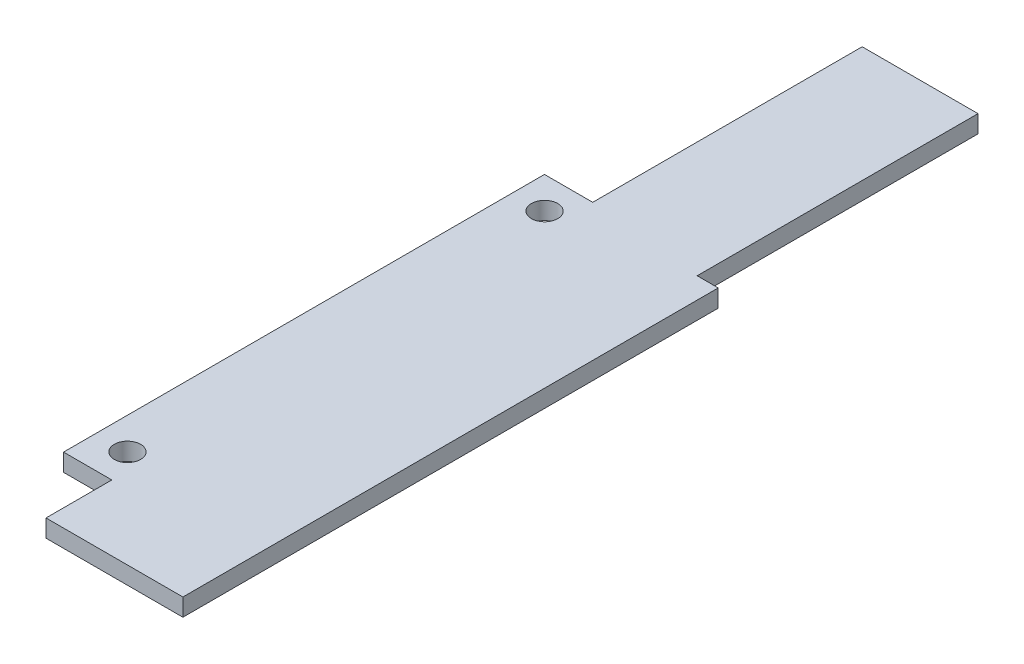
ISO-10303-21;
HEADER;
FILE_DESCRIPTION(('STEP AP214'),'2;1');
FILE_NAME('part.step','',(''),(''),'','','');
FILE_SCHEMA(('AUTOMOTIVE_DESIGN { 1 0 10303 214 1 1 1 1 }'));
ENDSEC;
DATA;
#1=APPLICATION_CONTEXT('core data for automotive mechanical design processes');
#2=APPLICATION_PROTOCOL_DEFINITION('international standard','automotive_design',2000,#1);
#3=PRODUCT_CONTEXT('',#1,'mechanical');
#4=PRODUCT('Part','Part','',(#3));
#5=PRODUCT_RELATED_PRODUCT_CATEGORY('part','',(#4));
#6=PRODUCT_DEFINITION_FORMATION('','',#4);
#7=PRODUCT_DEFINITION_CONTEXT('part definition',#1,'design');
#8=PRODUCT_DEFINITION('design','',#6,#7);
#9=PRODUCT_DEFINITION_SHAPE('','',#8);
#10=(LENGTH_UNIT() NAMED_UNIT(*) SI_UNIT(.MILLI.,.METRE.));
#11=(NAMED_UNIT(*) PLANE_ANGLE_UNIT() SI_UNIT($,.RADIAN.));
#12=(NAMED_UNIT(*) SI_UNIT($,.STERADIAN.) SOLID_ANGLE_UNIT());
#13=UNCERTAINTY_MEASURE_WITH_UNIT(LENGTH_MEASURE(1.E-05),#10,'distance_accuracy_value','');
#14=(GEOMETRIC_REPRESENTATION_CONTEXT(3) GLOBAL_UNCERTAINTY_ASSIGNED_CONTEXT((#13)) GLOBAL_UNIT_ASSIGNED_CONTEXT((#10,
#11,#12)) REPRESENTATION_CONTEXT('',''));
#15=CARTESIAN_POINT('',(0.,0.,0.));
#16=DIRECTION('',(0.,0.,1.));
#17=DIRECTION('',(1.,0.,0.));
#18=AXIS2_PLACEMENT_3D('',#15,#16,#17);
#19=CARTESIAN_POINT('',(44.8,21.5,-42.5));
#20=DIRECTION('',(0.,-1.,0.));
#21=DIRECTION('',(0.,0.,-1.));
#22=AXIS2_PLACEMENT_3D('',#19,#20,#21);
#23=PLANE('',#22);
#24=DIRECTION('',(1.,0.,0.));
#25=VECTOR('',#24,1.);
#26=CARTESIAN_POINT('',(-65.5,21.5,18.));
#27=LINE('',#26,#25);
#28=CARTESIAN_POINT('',(-65.5,21.5,18.));
#29=VERTEX_POINT('',#28);
#30=CARTESIAN_POINT('',(-60.,21.5,18.));
#31=VERTEX_POINT('',#30);
#32=EDGE_CURVE('E196',#29,#31,#27,.T.);
#33=ORIENTED_EDGE('',*,*,#32,.F.);
#34=DIRECTION('',(0.,0.,1.));
#35=VECTOR('',#34,1.);
#36=CARTESIAN_POINT('',(-65.5,21.5,-36.8));
#37=LINE('',#36,#35);
#38=CARTESIAN_POINT('',(-65.5,21.5,-36.8));
#39=VERTEX_POINT('',#38);
#40=EDGE_CURVE('E156',#39,#29,#37,.T.);
#41=ORIENTED_EDGE('',*,*,#40,.F.);
#42=DIRECTION('',(-1.,0.,0.));
#43=VECTOR('',#42,1.);
#44=CARTESIAN_POINT('',(-60.,21.5,-36.8));
#45=LINE('',#44,#43);
#46=CARTESIAN_POINT('',(-60.,21.5,-36.8));
#47=VERTEX_POINT('',#46);
#48=EDGE_CURVE('E201',#47,#39,#45,.T.);
#49=ORIENTED_EDGE('',*,*,#48,.F.);
#50=DIRECTION('',(0.,0.,1.));
#51=VECTOR('',#50,1.);
#52=CARTESIAN_POINT('',(-60.,21.5,-67.5));
#53=LINE('',#52,#51);
#54=CARTESIAN_POINT('',(-60.,21.5,-67.5));
#55=VERTEX_POINT('',#54);
#56=EDGE_CURVE('E143',#55,#47,#53,.T.);
#57=ORIENTED_EDGE('',*,*,#56,.F.);
#58=DIRECTION('',(-1.,0.,0.));
#59=VECTOR('',#58,1.);
#60=CARTESIAN_POINT('',(-55.3,21.5,-67.5));
#61=LINE('',#60,#59);
#62=CARTESIAN_POINT('',(-46.8,21.5,-67.5));
#63=VERTEX_POINT('',#62);
#64=EDGE_CURVE('E139',#63,#55,#61,.T.);
#65=ORIENTED_EDGE('',*,*,#64,.F.);
#66=DIRECTION('',(0.,0.,1.));
#67=VECTOR('',#66,1.);
#68=CARTESIAN_POINT('',(-46.8,21.5,-62.8));
#69=LINE('',#68,#67);
#70=CARTESIAN_POINT('',(-46.8,21.5,-35.5));
#71=VERTEX_POINT('',#70);
#72=EDGE_CURVE('E72',#63,#71,#69,.T.);
#73=ORIENTED_EDGE('',*,*,#72,.T.);
#74=DIRECTION('',(-1.,0.,0.));
#75=VECTOR('',#74,1.);
#76=CARTESIAN_POINT('',(-44.4,21.5,-35.5));
#77=LINE('',#76,#75);
#78=CARTESIAN_POINT('',(-44.4,21.5,-35.5));
#79=VERTEX_POINT('',#78);
#80=EDGE_CURVE('E188',#79,#71,#77,.T.);
#81=ORIENTED_EDGE('',*,*,#80,.F.);
#82=DIRECTION('',(0.,0.,-1.));
#83=VECTOR('',#82,1.);
#84=CARTESIAN_POINT('',(-44.4,21.5,-29.3));
#85=LINE('',#84,#83);
#86=CARTESIAN_POINT('',(-44.4,21.5,25.5));
#87=VERTEX_POINT('',#86);
#88=EDGE_CURVE('E120',#87,#79,#85,.T.);
#89=ORIENTED_EDGE('',*,*,#88,.F.);
#90=DIRECTION('',(1.,0.,0.));
#91=VECTOR('',#90,1.);
#92=CARTESIAN_POINT('',(-16.9,21.5,25.5));
#93=LINE('',#92,#91);
#94=CARTESIAN_POINT('',(-60.,21.5,25.5));
#95=VERTEX_POINT('',#94);
#96=EDGE_CURVE('E185',#95,#87,#93,.T.);
#97=ORIENTED_EDGE('',*,*,#96,.F.);
#98=DIRECTION('',(0.,0.,1.));
#99=VECTOR('',#98,1.);
#100=CARTESIAN_POINT('',(-60.,21.5,18.));
#101=LINE('',#100,#99);
#102=EDGE_CURVE('E148',#31,#95,#101,.T.);
#103=ORIENTED_EDGE('',*,*,#102,.F.);
#104=EDGE_LOOP('',(#33,#41,#49,#57,#65,#73,#81,#89,#97,#103));
#105=FACE_BOUND('',#104,.T.);
#106=CARTESIAN_POINT('',(-61.8792707762021,21.5,-33.1911439682998));
#107=DIRECTION('',(0.,1.,0.));
#108=DIRECTION('',(0.,0.,1.));
#109=AXIS2_PLACEMENT_3D('',#106,#107,#108);
#110=CIRCLE('',#109,1.5);
#111=CARTESIAN_POINT('',(-61.8792707762021,21.5,-31.6911439682998));
#112=VERTEX_POINT('',#111);
#113=EDGE_CURVE('E63',#112,#112,#110,.T.);
#114=ORIENTED_EDGE('',*,*,#113,.T.);
#115=EDGE_LOOP('',(#114));
#116=FACE_BOUND('',#115,.T.);
#117=CARTESIAN_POINT('',(-61.8792707762021,21.5,14.3376182989599));
#118=DIRECTION('',(0.,1.,0.));
#119=DIRECTION('',(0.,0.,1.));
#120=AXIS2_PLACEMENT_3D('',#117,#118,#119);
#121=CIRCLE('',#120,1.5);
#122=CARTESIAN_POINT('',(-61.8792707762021,21.5,15.8376182989599));
#123=VERTEX_POINT('',#122);
#124=EDGE_CURVE('E11',#123,#123,#121,.T.);
#125=ORIENTED_EDGE('',*,*,#124,.T.);
#126=EDGE_LOOP('',(#125));
#127=FACE_BOUND('',#126,.T.);
#128=ADVANCED_FACE('F53',(#105,#116,#127),#23,.T.);
#129=CARTESIAN_POINT('',(-60.,23.5,-67.5));
#130=DIRECTION('',(1.,0.,0.));
#131=DIRECTION('',(0.,0.,-1.));
#132=AXIS2_PLACEMENT_3D('',#129,#130,#131);
#133=PLANE('',#132);
#134=ORIENTED_EDGE('',*,*,#56,.T.);
#135=DIRECTION('',(0.,-1.,0.));
#136=VECTOR('',#135,1.);
#137=CARTESIAN_POINT('',(-60.,23.5,-36.8));
#138=LINE('',#137,#136);
#139=CARTESIAN_POINT('',(-60.,23.5,-36.8));
#140=VERTEX_POINT('',#139);
#141=EDGE_CURVE('E180',#140,#47,#138,.T.);
#142=ORIENTED_EDGE('',*,*,#141,.F.);
#143=DIRECTION('',(0.,0.,1.));
#144=VECTOR('',#143,1.);
#145=CARTESIAN_POINT('',(-60.,23.5,-67.5));
#146=LINE('',#145,#144);
#147=CARTESIAN_POINT('',(-60.,23.5,-67.5));
#148=VERTEX_POINT('',#147);
#149=EDGE_CURVE('E211',#148,#140,#146,.T.);
#150=ORIENTED_EDGE('',*,*,#149,.F.);
#151=DIRECTION('',(0.,-1.,0.));
#152=VECTOR('',#151,1.);
#153=CARTESIAN_POINT('',(-60.,23.5,-67.5));
#154=LINE('',#153,#152);
#155=EDGE_CURVE('E57',#148,#55,#154,.T.);
#156=ORIENTED_EDGE('',*,*,#155,.T.);
#157=EDGE_LOOP('',(#134,#142,#150,#156));
#158=FACE_BOUND('',#157,.T.);
#159=ADVANCED_FACE('F253',(#158),#133,.F.);
#160=CARTESIAN_POINT('',(-65.5,23.5,18.));
#161=DIRECTION('',(0.,0.,-1.));
#162=DIRECTION('',(-1.,0.,0.));
#163=AXIS2_PLACEMENT_3D('',#160,#161,#162);
#164=PLANE('',#163);
#165=ORIENTED_EDGE('',*,*,#32,.T.);
#166=DIRECTION('',(0.,-1.,0.));
#167=VECTOR('',#166,1.);
#168=CARTESIAN_POINT('',(-60.,23.5,18.));
#169=LINE('',#168,#167);
#170=CARTESIAN_POINT('',(-60.,23.5,18.));
#171=VERTEX_POINT('',#170);
#172=EDGE_CURVE('E172',#171,#31,#169,.T.);
#173=ORIENTED_EDGE('',*,*,#172,.F.);
#174=DIRECTION('',(1.,0.,0.));
#175=VECTOR('',#174,1.);
#176=CARTESIAN_POINT('',(-65.5,23.5,18.));
#177=LINE('',#176,#175);
#178=CARTESIAN_POINT('',(-65.5,23.5,18.));
#179=VERTEX_POINT('',#178);
#180=EDGE_CURVE('E217',#179,#171,#177,.T.);
#181=ORIENTED_EDGE('',*,*,#180,.F.);
#182=DIRECTION('',(0.,-1.,0.));
#183=VECTOR('',#182,1.);
#184=CARTESIAN_POINT('',(-65.5,23.5,18.));
#185=LINE('',#184,#183);
#186=EDGE_CURVE('E175',#179,#29,#185,.T.);
#187=ORIENTED_EDGE('',*,*,#186,.T.);
#188=EDGE_LOOP('',(#165,#173,#181,#187));
#189=FACE_BOUND('',#188,.T.);
#190=ADVANCED_FACE('F246',(#189),#164,.F.);
#191=CARTESIAN_POINT('',(-65.5,23.5,-36.8));
#192=DIRECTION('',(1.,0.,0.));
#193=DIRECTION('',(0.,0.,-1.));
#194=AXIS2_PLACEMENT_3D('',#191,#192,#193);
#195=PLANE('',#194);
#196=ORIENTED_EDGE('',*,*,#40,.T.);
#197=ORIENTED_EDGE('',*,*,#186,.F.);
#198=DIRECTION('',(0.,0.,1.));
#199=VECTOR('',#198,1.);
#200=CARTESIAN_POINT('',(-65.5,23.5,-36.8));
#201=LINE('',#200,#199);
#202=CARTESIAN_POINT('',(-65.5,23.5,-36.8));
#203=VERTEX_POINT('',#202);
#204=EDGE_CURVE('E215',#203,#179,#201,.T.);
#205=ORIENTED_EDGE('',*,*,#204,.F.);
#206=DIRECTION('',(0.,-1.,0.));
#207=VECTOR('',#206,1.);
#208=CARTESIAN_POINT('',(-65.5,23.5,-36.8));
#209=LINE('',#208,#207);
#210=EDGE_CURVE('E178',#203,#39,#209,.T.);
#211=ORIENTED_EDGE('',*,*,#210,.T.);
#212=EDGE_LOOP('',(#196,#197,#205,#211));
#213=FACE_BOUND('',#212,.T.);
#214=ADVANCED_FACE('F239',(#213),#195,.F.);
#215=CARTESIAN_POINT('',(-44.4,23.5,25.5));
#216=DIRECTION('',(0.,0.,-1.));
#217=DIRECTION('',(-1.,0.,0.));
#218=AXIS2_PLACEMENT_3D('',#215,#216,#217);
#219=PLANE('',#218);
#220=DIRECTION('',(0.,-1.,0.));
#221=VECTOR('',#220,1.);
#222=CARTESIAN_POINT('',(-60.,23.5,25.5));
#223=LINE('',#222,#221);
#224=CARTESIAN_POINT('',(-60.,23.5,25.5));
#225=VERTEX_POINT('',#224);
#226=EDGE_CURVE('E169',#225,#95,#223,.T.);
#227=ORIENTED_EDGE('',*,*,#226,.T.);
#228=ORIENTED_EDGE('',*,*,#96,.T.);
#229=DIRECTION('',(0.,-1.,0.));
#230=VECTOR('',#229,1.);
#231=CARTESIAN_POINT('',(-44.4,23.5,25.5));
#232=LINE('',#231,#230);
#233=CARTESIAN_POINT('',(-44.4,23.5,25.5));
#234=VERTEX_POINT('',#233);
#235=EDGE_CURVE('E167',#234,#87,#232,.T.);
#236=ORIENTED_EDGE('',*,*,#235,.F.);
#237=DIRECTION('',(1.,0.,0.));
#238=VECTOR('',#237,1.);
#239=CARTESIAN_POINT('',(-46.4,23.5,25.5));
#240=LINE('',#239,#238);
#241=EDGE_CURVE('E221',#225,#234,#240,.T.);
#242=ORIENTED_EDGE('',*,*,#241,.F.);
#243=EDGE_LOOP('',(#227,#228,#236,#242));
#244=FACE_BOUND('',#243,.T.);
#245=ADVANCED_FACE('F237',(#244),#219,.F.);
#246=CARTESIAN_POINT('',(-44.4,23.5,10.5));
#247=DIRECTION('',(-1.,0.,0.));
#248=DIRECTION('',(0.,0.,1.));
#249=AXIS2_PLACEMENT_3D('',#246,#247,#248);
#250=PLANE('',#249);
#251=ORIENTED_EDGE('',*,*,#235,.T.);
#252=ORIENTED_EDGE('',*,*,#88,.T.);
#253=DIRECTION('',(0.,-1.,0.));
#254=VECTOR('',#253,1.);
#255=CARTESIAN_POINT('',(-44.4,23.5,-35.5));
#256=LINE('',#255,#254);
#257=CARTESIAN_POINT('',(-44.4,23.5,-35.5));
#258=VERTEX_POINT('',#257);
#259=EDGE_CURVE('E160',#258,#79,#256,.T.);
#260=ORIENTED_EDGE('',*,*,#259,.F.);
#261=DIRECTION('',(0.,0.,-1.));
#262=VECTOR('',#261,1.);
#263=CARTESIAN_POINT('',(-44.4,23.5,10.5));
#264=LINE('',#263,#262);
#265=EDGE_CURVE('E223',#234,#258,#264,.T.);
#266=ORIENTED_EDGE('',*,*,#265,.F.);
#267=EDGE_LOOP('',(#251,#252,#260,#266));
#268=FACE_BOUND('',#267,.T.);
#269=ADVANCED_FACE('F228',(#268),#250,.F.);
#270=CARTESIAN_POINT('',(-46.8,23.5,-35.5));
#271=DIRECTION('',(0.,0.,1.));
#272=DIRECTION('',(1.,0.,0.));
#273=AXIS2_PLACEMENT_3D('',#270,#271,#272);
#274=PLANE('',#273);
#275=ORIENTED_EDGE('',*,*,#80,.T.);
#276=DIRECTION('',(0.,-1.,0.));
#277=VECTOR('',#276,1.);
#278=CARTESIAN_POINT('',(-46.8,23.5,-35.5));
#279=LINE('',#278,#277);
#280=CARTESIAN_POINT('',(-46.8,23.5,-35.5));
#281=VERTEX_POINT('',#280);
#282=EDGE_CURVE('E155',#281,#71,#279,.T.);
#283=ORIENTED_EDGE('',*,*,#282,.F.);
#284=DIRECTION('',(-1.,0.,0.));
#285=VECTOR('',#284,1.);
#286=CARTESIAN_POINT('',(-46.8,23.5,-35.5));
#287=LINE('',#286,#285);
#288=EDGE_CURVE('E107',#258,#281,#287,.T.);
#289=ORIENTED_EDGE('',*,*,#288,.F.);
#290=ORIENTED_EDGE('',*,*,#259,.T.);
#291=EDGE_LOOP('',(#275,#283,#289,#290));
#292=FACE_BOUND('',#291,.T.);
#293=ADVANCED_FACE('F230',(#292),#274,.F.);
#294=CARTESIAN_POINT('',(0.,23.5,0.));
#295=DIRECTION('',(0.,1.,0.));
#296=DIRECTION('',(0.,0.,1.));
#297=AXIS2_PLACEMENT_3D('',#294,#295,#296);
#298=PLANE('',#297);
#299=CARTESIAN_POINT('',(-61.8792707762021,23.5,14.3376182989599));
#300=DIRECTION('',(0.,1.,0.));
#301=DIRECTION('',(0.,0.,1.));
#302=AXIS2_PLACEMENT_3D('',#299,#300,#301);
#303=CIRCLE('',#302,1.5);
#304=CARTESIAN_POINT('',(-61.8792707762021,23.5,15.8376182989599));
#305=VERTEX_POINT('',#304);
#306=EDGE_CURVE('E207',#305,#305,#303,.T.);
#307=ORIENTED_EDGE('',*,*,#306,.F.);
#308=EDGE_LOOP('',(#307));
#309=FACE_BOUND('',#308,.T.);
#310=DIRECTION('',(-1.,0.,0.));
#311=VECTOR('',#310,1.);
#312=CARTESIAN_POINT('',(-46.8,23.5,-67.5));
#313=LINE('',#312,#311);
#314=CARTESIAN_POINT('',(-46.8,23.5,-67.5));
#315=VERTEX_POINT('',#314);
#316=EDGE_CURVE('E158',#315,#148,#313,.T.);
#317=ORIENTED_EDGE('',*,*,#316,.T.);
#318=ORIENTED_EDGE('',*,*,#149,.T.);
#319=DIRECTION('',(-1.,0.,0.));
#320=VECTOR('',#319,1.);
#321=CARTESIAN_POINT('',(-60.,23.5,-36.8));
#322=LINE('',#321,#320);
#323=EDGE_CURVE('E213',#140,#203,#322,.T.);
#324=ORIENTED_EDGE('',*,*,#323,.T.);
#325=ORIENTED_EDGE('',*,*,#204,.T.);
#326=ORIENTED_EDGE('',*,*,#180,.T.);
#327=DIRECTION('',(0.,0.,1.));
#328=VECTOR('',#327,1.);
#329=CARTESIAN_POINT('',(-60.,23.5,25.5));
#330=LINE('',#329,#328);
#331=EDGE_CURVE('E219',#171,#225,#330,.T.);
#332=ORIENTED_EDGE('',*,*,#331,.T.);
#333=ORIENTED_EDGE('',*,*,#241,.T.);
#334=ORIENTED_EDGE('',*,*,#265,.T.);
#335=ORIENTED_EDGE('',*,*,#288,.T.);
#336=DIRECTION('',(0.,0.,-1.));
#337=VECTOR('',#336,1.);
#338=CARTESIAN_POINT('',(-46.8,23.5,-62.8));
#339=LINE('',#338,#337);
#340=EDGE_CURVE('E112',#281,#315,#339,.T.);
#341=ORIENTED_EDGE('',*,*,#340,.T.);
#342=EDGE_LOOP('',(#317,#318,#324,#325,#326,#332,#333,#334,#335,#341));
#343=FACE_BOUND('',#342,.T.);
#344=CARTESIAN_POINT('',(-61.8792707762021,23.5,-33.1911439682998));
#345=DIRECTION('',(0.,1.,0.));
#346=DIRECTION('',(0.,0.,1.));
#347=AXIS2_PLACEMENT_3D('',#344,#345,#346);
#348=CIRCLE('',#347,1.5);
#349=CARTESIAN_POINT('',(-61.8792707762021,23.5,-31.6911439682998));
#350=VERTEX_POINT('',#349);
#351=EDGE_CURVE('E204',#350,#350,#348,.T.);
#352=ORIENTED_EDGE('',*,*,#351,.F.);
#353=EDGE_LOOP('',(#352));
#354=FACE_BOUND('',#353,.T.);
#355=ADVANCED_FACE('F225',(#309,#343,#354),#298,.T.);
#356=CARTESIAN_POINT('',(-46.8,23.5,-67.5));
#357=DIRECTION('',(0.,0.,1.));
#358=DIRECTION('',(1.,0.,0.));
#359=AXIS2_PLACEMENT_3D('',#356,#357,#358);
#360=PLANE('',#359);
#361=DIRECTION('',(0.,-1.,0.));
#362=VECTOR('',#361,1.);
#363=CARTESIAN_POINT('',(-46.8,23.5,-67.5));
#364=LINE('',#363,#362);
#365=EDGE_CURVE('E153',#315,#63,#364,.T.);
#366=ORIENTED_EDGE('',*,*,#365,.T.);
#367=ORIENTED_EDGE('',*,*,#64,.T.);
#368=ORIENTED_EDGE('',*,*,#155,.F.);
#369=ORIENTED_EDGE('',*,*,#316,.F.);
#370=EDGE_LOOP('',(#366,#367,#368,#369));
#371=FACE_BOUND('',#370,.T.);
#372=ADVANCED_FACE('F55',(#371),#360,.F.);
#373=CARTESIAN_POINT('',(-46.8,23.5,-62.8));
#374=DIRECTION('',(-1.,0.,0.));
#375=DIRECTION('',(0.,0.,1.));
#376=AXIS2_PLACEMENT_3D('',#373,#374,#375);
#377=PLANE('',#376);
#378=ORIENTED_EDGE('',*,*,#282,.T.);
#379=ORIENTED_EDGE('',*,*,#72,.F.);
#380=ORIENTED_EDGE('',*,*,#365,.F.);
#381=ORIENTED_EDGE('',*,*,#340,.F.);
#382=EDGE_LOOP('',(#378,#379,#380,#381));
#383=FACE_BOUND('',#382,.T.);
#384=ADVANCED_FACE('F152',(#383),#377,.F.);
#385=CARTESIAN_POINT('',(-60.,23.5,25.5));
#386=DIRECTION('',(1.,0.,0.));
#387=DIRECTION('',(0.,0.,-1.));
#388=AXIS2_PLACEMENT_3D('',#385,#386,#387);
#389=PLANE('',#388);
#390=ORIENTED_EDGE('',*,*,#102,.T.);
#391=ORIENTED_EDGE('',*,*,#226,.F.);
#392=ORIENTED_EDGE('',*,*,#331,.F.);
#393=ORIENTED_EDGE('',*,*,#172,.T.);
#394=EDGE_LOOP('',(#390,#391,#392,#393));
#395=FACE_BOUND('',#394,.T.);
#396=ADVANCED_FACE('F234',(#395),#389,.F.);
#397=CARTESIAN_POINT('',(-60.,23.5,-36.8));
#398=DIRECTION('',(0.,0.,1.));
#399=DIRECTION('',(1.,0.,0.));
#400=AXIS2_PLACEMENT_3D('',#397,#398,#399);
#401=PLANE('',#400);
#402=ORIENTED_EDGE('',*,*,#48,.T.);
#403=ORIENTED_EDGE('',*,*,#210,.F.);
#404=ORIENTED_EDGE('',*,*,#323,.F.);
#405=ORIENTED_EDGE('',*,*,#141,.T.);
#406=EDGE_LOOP('',(#402,#403,#404,#405));
#407=FACE_BOUND('',#406,.T.);
#408=ADVANCED_FACE('F249',(#407),#401,.F.);
#409=CARTESIAN_POINT('',(-61.8792707762021,23.5,14.3376182989599));
#410=DIRECTION('',(0.,-1.,0.));
#411=DIRECTION('',(0.,0.,-1.));
#412=AXIS2_PLACEMENT_3D('',#409,#410,#411);
#413=CYLINDRICAL_SURFACE('',#412,1.5);
#414=ORIENTED_EDGE('',*,*,#306,.T.);
#415=EDGE_LOOP('',(#414));
#416=FACE_BOUND('',#415,.T.);
#417=ORIENTED_EDGE('',*,*,#124,.F.);
#418=EDGE_LOOP('',(#417));
#419=FACE_BOUND('',#418,.T.);
#420=ADVANCED_FACE('F261',(#416,#419),#413,.F.);
#421=CARTESIAN_POINT('',(-61.8792707762021,23.5,-33.1911439682998));
#422=DIRECTION('',(0.,-1.,0.));
#423=DIRECTION('',(0.,0.,-1.));
#424=AXIS2_PLACEMENT_3D('',#421,#422,#423);
#425=CYLINDRICAL_SURFACE('',#424,1.5);
#426=ORIENTED_EDGE('',*,*,#351,.T.);
#427=EDGE_LOOP('',(#426));
#428=FACE_BOUND('',#427,.T.);
#429=ORIENTED_EDGE('',*,*,#113,.F.);
#430=EDGE_LOOP('',(#429));
#431=FACE_BOUND('',#430,.T.);
#432=ADVANCED_FACE('F255',(#428,#431),#425,.F.);
#433=CLOSED_SHELL('',(#128,#159,#190,#214,#245,#269,#293,#355,#372,#384,#396,#408,#420,#432));
#434=MANIFOLD_SOLID_BREP('B2',#433);
#435=ADVANCED_BREP_SHAPE_REPRESENTATION('',(#18,#434),#14);
#436=SHAPE_DEFINITION_REPRESENTATION(#9,#435);
ENDSEC;
END-ISO-10303-21;
